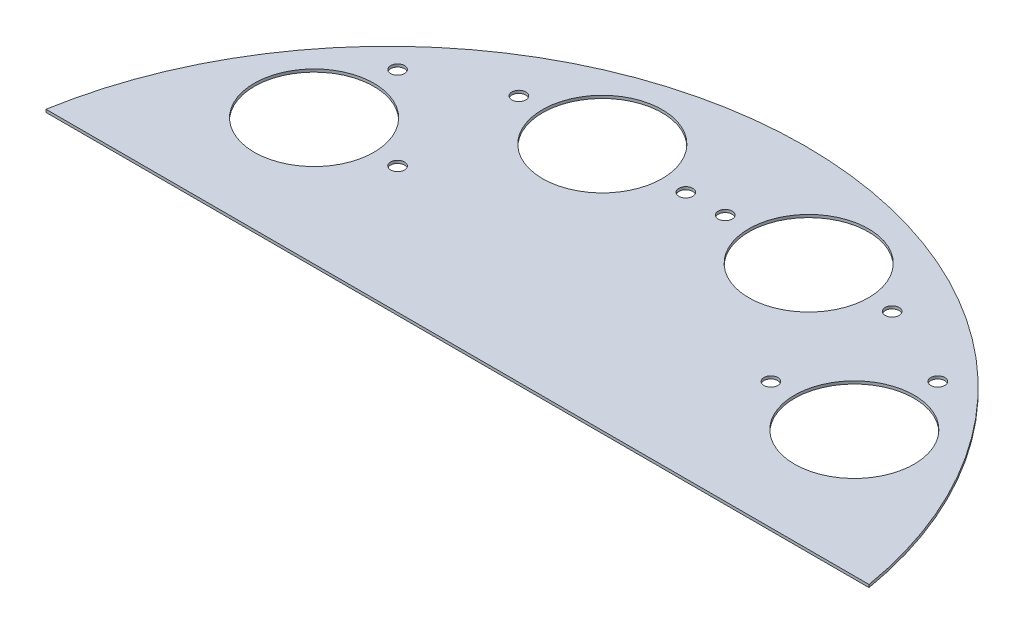
ISO-10303-21;
HEADER;
FILE_DESCRIPTION(('STEP AP214'),'2;1');
FILE_NAME('part.step','',(''),(''),'','','');
FILE_SCHEMA(('AUTOMOTIVE_DESIGN { 1 0 10303 214 1 1 1 1 }'));
ENDSEC;
DATA;
#1=APPLICATION_CONTEXT('core data for automotive mechanical design processes');
#2=APPLICATION_PROTOCOL_DEFINITION('international standard','automotive_design',2000,#1);
#3=PRODUCT_CONTEXT('',#1,'mechanical');
#4=PRODUCT('Part','Part','',(#3));
#5=PRODUCT_RELATED_PRODUCT_CATEGORY('part','',(#4));
#6=PRODUCT_DEFINITION_FORMATION('','',#4);
#7=PRODUCT_DEFINITION_CONTEXT('part definition',#1,'design');
#8=PRODUCT_DEFINITION('design','',#6,#7);
#9=PRODUCT_DEFINITION_SHAPE('','',#8);
#10=(LENGTH_UNIT() NAMED_UNIT(*) SI_UNIT(.MILLI.,.METRE.));
#11=(NAMED_UNIT(*) PLANE_ANGLE_UNIT() SI_UNIT($,.RADIAN.));
#12=(NAMED_UNIT(*) SI_UNIT($,.STERADIAN.) SOLID_ANGLE_UNIT());
#13=UNCERTAINTY_MEASURE_WITH_UNIT(LENGTH_MEASURE(1.E-05),#10,'distance_accuracy_value','');
#14=(GEOMETRIC_REPRESENTATION_CONTEXT(3) GLOBAL_UNCERTAINTY_ASSIGNED_CONTEXT((#13)) GLOBAL_UNIT_ASSIGNED_CONTEXT((#10,
#11,#12)) REPRESENTATION_CONTEXT('',''));
#15=CARTESIAN_POINT('',(0.,0.,0.));
#16=DIRECTION('',(0.,0.,1.));
#17=DIRECTION('',(1.,0.,0.));
#18=AXIS2_PLACEMENT_3D('',#15,#16,#17);
#19=CARTESIAN_POINT('',(0.,0.,0.));
#20=DIRECTION('',(0.,1.,0.));
#21=DIRECTION('',(0.,0.,1.));
#22=AXIS2_PLACEMENT_3D('',#19,#20,#21);
#23=PLANE('',#22);
#24=CARTESIAN_POINT('',(97.237534512333,0.,-56.561617597691));
#25=DIRECTION('',(0.,-1.,0.));
#26=DIRECTION('',(0.,0.,-1.));
#27=AXIS2_PLACEMENT_3D('',#24,#25,#26);
#28=CIRCLE('',#27,2.49999999999999);
#29=CARTESIAN_POINT('',(97.237534512333,0.,-59.061617597691));
#30=VERTEX_POINT('',#29);
#31=EDGE_CURVE('E166',#30,#30,#28,.T.);
#32=ORIENTED_EDGE('',*,*,#31,.F.);
#33=EDGE_LOOP('',(#32));
#34=FACE_BOUND('',#33,.T.);
#35=CARTESIAN_POINT('',(67.237534512333,0.,-26.561617597691));
#36=DIRECTION('',(0.,-1.,0.));
#37=DIRECTION('',(0.,0.,-1.));
#38=AXIS2_PLACEMENT_3D('',#35,#36,#37);
#39=CIRCLE('',#38,2.49999999999999);
#40=CARTESIAN_POINT('',(67.237534512333,0.,-29.061617597691));
#41=VERTEX_POINT('',#40);
#42=EDGE_CURVE('E160',#41,#41,#39,.T.);
#43=ORIENTED_EDGE('',*,*,#42,.F.);
#44=EDGE_LOOP('',(#43));
#45=FACE_BOUND('',#44,.T.);
#46=CARTESIAN_POINT('',(67.2375345123306,0.,-70.1541692780059));
#47=DIRECTION('',(0.,-1.,0.));
#48=DIRECTION('',(0.,0.,-1.));
#49=AXIS2_PLACEMENT_3D('',#46,#47,#48);
#50=CIRCLE('',#49,2.49999999999999);
#51=CARTESIAN_POINT('',(67.2375345123306,0.,-72.6541692780059));
#52=VERTEX_POINT('',#51);
#53=EDGE_CURVE('E154',#52,#52,#50,.T.);
#54=ORIENTED_EDGE('',*,*,#53,.F.);
#55=EDGE_LOOP('',(#54));
#56=FACE_BOUND('',#55,.T.);
#57=CARTESIAN_POINT('',(7.23753451233063,0.,-70.1541692780059));
#58=DIRECTION('',(0.,-1.,0.));
#59=DIRECTION('',(0.,0.,-1.));
#60=AXIS2_PLACEMENT_3D('',#57,#58,#59);
#61=CIRCLE('',#60,2.49999999999999);
#62=CARTESIAN_POINT('',(7.23753451233063,0.,-72.6541692780059));
#63=VERTEX_POINT('',#62);
#64=EDGE_CURVE('E148',#63,#63,#61,.T.);
#65=ORIENTED_EDGE('',*,*,#64,.F.);
#66=EDGE_LOOP('',(#65));
#67=FACE_BOUND('',#66,.T.);
#68=CARTESIAN_POINT('',(-66.926544137657,0.,-70.1541692780059));
#69=DIRECTION('',(0.,-1.,0.));
#70=DIRECTION('',(0.,0.,-1.));
#71=AXIS2_PLACEMENT_3D('',#68,#69,#70);
#72=CIRCLE('',#71,2.49999999999999);
#73=CARTESIAN_POINT('',(-66.926544137657,0.,-72.6541692780059));
#74=VERTEX_POINT('',#73);
#75=EDGE_CURVE('E136',#74,#74,#72,.T.);
#76=ORIENTED_EDGE('',*,*,#75,.F.);
#77=EDGE_LOOP('',(#76));
#78=FACE_BOUND('',#77,.T.);
#79=CARTESIAN_POINT('',(-96.9265441376548,0.,-56.5616175976809));
#80=DIRECTION('',(0.,-1.,0.));
#81=DIRECTION('',(0.,0.,-1.));
#82=AXIS2_PLACEMENT_3D('',#79,#80,#81);
#83=CIRCLE('',#82,2.49999999999999);
#84=CARTESIAN_POINT('',(-96.9265441376548,0.,-59.0616175976809));
#85=VERTEX_POINT('',#84);
#86=EDGE_CURVE('E127',#85,#85,#83,.T.);
#87=ORIENTED_EDGE('',*,*,#86,.F.);
#88=EDGE_LOOP('',(#87));
#89=FACE_BOUND('',#88,.T.);
#90=CARTESIAN_POINT('',(-66.9265441376548,0.,-26.561617597691));
#91=DIRECTION('',(0.,-1.,0.));
#92=DIRECTION('',(0.,0.,-1.));
#93=AXIS2_PLACEMENT_3D('',#90,#91,#92);
#94=CIRCLE('',#93,2.49999999999999);
#95=CARTESIAN_POINT('',(-66.9265441376548,0.,-29.061617597691));
#96=VERTEX_POINT('',#95);
#97=EDGE_CURVE('E126',#96,#96,#94,.T.);
#98=ORIENTED_EDGE('',*,*,#97,.F.);
#99=EDGE_LOOP('',(#98));
#100=FACE_BOUND('',#99,.T.);
#101=CARTESIAN_POINT('',(0.155495187338843,0.,43.9726126774052));
#102=DIRECTION('',(0.,1.,0.));
#103=DIRECTION('',(0.,0.,1.));
#104=AXIS2_PLACEMENT_3D('',#101,#102,#103);
#105=CIRCLE('',#104,150.);
#106=CARTESIAN_POINT('',(148.057489764829,0.,18.9726126774052));
#107=VERTEX_POINT('',#106);
#108=CARTESIAN_POINT('',(-147.746499390152,0.,18.9726126774052));
#109=VERTEX_POINT('',#108);
#110=EDGE_CURVE('E60',#107,#109,#105,.T.);
#111=ORIENTED_EDGE('',*,*,#110,.F.);
#112=DIRECTION('',(-1.,0.,0.));
#113=VECTOR('',#112,1.);
#114=CARTESIAN_POINT('',(0.,0.,18.9726126774052));
#115=LINE('',#114,#113);
#116=EDGE_CURVE('E67',#107,#109,#115,.T.);
#117=ORIENTED_EDGE('',*,*,#116,.T.);
#118=EDGE_LOOP('',(#111,#117));
#119=FACE_BOUND('',#118,.T.);
#120=CARTESIAN_POINT('',(-96.9265441376548,0.,-26.5616175976809));
#121=DIRECTION('',(0.,1.,0.));
#122=DIRECTION('',(0.,0.,1.));
#123=AXIS2_PLACEMENT_3D('',#120,#121,#122);
#124=CIRCLE('',#123,21.5);
#125=CARTESIAN_POINT('',(-96.9265441376548,0.,-5.0616175976809));
#126=VERTEX_POINT('',#125);
#127=EDGE_CURVE('E71',#126,#126,#124,.T.);
#128=ORIENTED_EDGE('',*,*,#127,.T.);
#129=EDGE_LOOP('',(#128));
#130=FACE_BOUND('',#129,.T.);
#131=CARTESIAN_POINT('',(-36.926544137657,0.,-70.1541692780059));
#132=DIRECTION('',(0.,1.,0.));
#133=DIRECTION('',(0.,0.,1.));
#134=AXIS2_PLACEMENT_3D('',#131,#132,#133);
#135=CIRCLE('',#134,21.5);
#136=CARTESIAN_POINT('',(-36.926544137657,0.,-48.6541692780059));
#137=VERTEX_POINT('',#136);
#138=EDGE_CURVE('E74',#137,#137,#135,.T.);
#139=ORIENTED_EDGE('',*,*,#138,.T.);
#140=EDGE_LOOP('',(#139));
#141=FACE_BOUND('',#140,.T.);
#142=CARTESIAN_POINT('',(37.2375345123306,0.,-70.1541692780098));
#143=DIRECTION('',(0.,1.,0.));
#144=DIRECTION('',(0.,0.,1.));
#145=AXIS2_PLACEMENT_3D('',#142,#143,#144);
#146=CIRCLE('',#145,21.5);
#147=CARTESIAN_POINT('',(37.2375345123306,0.,-48.6541692780098));
#148=VERTEX_POINT('',#147);
#149=EDGE_CURVE('E80',#148,#148,#146,.T.);
#150=ORIENTED_EDGE('',*,*,#149,.T.);
#151=EDGE_LOOP('',(#150));
#152=FACE_BOUND('',#151,.T.);
#153=CARTESIAN_POINT('',(97.237534512333,0.,-26.561617597691));
#154=DIRECTION('',(0.,1.,0.));
#155=DIRECTION('',(0.,0.,1.));
#156=AXIS2_PLACEMENT_3D('',#153,#154,#155);
#157=CIRCLE('',#156,21.5);
#158=CARTESIAN_POINT('',(97.237534512333,0.,-5.06161759769103));
#159=VERTEX_POINT('',#158);
#160=EDGE_CURVE('E83',#159,#159,#157,.T.);
#161=ORIENTED_EDGE('',*,*,#160,.T.);
#162=EDGE_LOOP('',(#161));
#163=FACE_BOUND('',#162,.T.);
#164=CARTESIAN_POINT('',(-6.92654413765696,0.,-70.1541692780059));
#165=DIRECTION('',(0.,-1.,0.));
#166=DIRECTION('',(0.,0.,-1.));
#167=AXIS2_PLACEMENT_3D('',#164,#165,#166);
#168=CIRCLE('',#167,2.49999999999999);
#169=CARTESIAN_POINT('',(-6.92654413765696,0.,-72.6541692780059));
#170=VERTEX_POINT('',#169);
#171=EDGE_CURVE('E142',#170,#170,#168,.T.);
#172=ORIENTED_EDGE('',*,*,#171,.F.);
#173=EDGE_LOOP('',(#172));
#174=FACE_BOUND('',#173,.T.);
#175=ADVANCED_FACE('F35',(#34,#45,#56,#67,#78,#89,#100,#119,#130,#141,#152,#163,#174),#23,.F.);
#176=CARTESIAN_POINT('',(0.,1.,0.));
#177=DIRECTION('',(0.,1.,0.));
#178=DIRECTION('',(0.,0.,1.));
#179=AXIS2_PLACEMENT_3D('',#176,#177,#178);
#180=PLANE('',#179);
#181=CARTESIAN_POINT('',(97.237534512333,1.,-56.561617597691));
#182=DIRECTION('',(0.,-1.,0.));
#183=DIRECTION('',(0.,0.,-1.));
#184=AXIS2_PLACEMENT_3D('',#181,#182,#183);
#185=CIRCLE('',#184,2.5);
#186=CARTESIAN_POINT('',(97.237534512333,1.,-59.061617597691));
#187=VERTEX_POINT('',#186);
#188=EDGE_CURVE('E163',#187,#187,#185,.T.);
#189=ORIENTED_EDGE('',*,*,#188,.T.);
#190=EDGE_LOOP('',(#189));
#191=FACE_BOUND('',#190,.T.);
#192=CARTESIAN_POINT('',(67.237534512333,1.,-26.561617597691));
#193=DIRECTION('',(0.,-1.,0.));
#194=DIRECTION('',(0.,0.,-1.));
#195=AXIS2_PLACEMENT_3D('',#192,#193,#194);
#196=CIRCLE('',#195,2.5);
#197=CARTESIAN_POINT('',(67.237534512333,1.,-29.061617597691));
#198=VERTEX_POINT('',#197);
#199=EDGE_CURVE('E157',#198,#198,#196,.T.);
#200=ORIENTED_EDGE('',*,*,#199,.T.);
#201=EDGE_LOOP('',(#200));
#202=FACE_BOUND('',#201,.T.);
#203=CARTESIAN_POINT('',(67.2375345123306,1.,-70.1541692780059));
#204=DIRECTION('',(0.,-1.,0.));
#205=DIRECTION('',(0.,0.,-1.));
#206=AXIS2_PLACEMENT_3D('',#203,#204,#205);
#207=CIRCLE('',#206,2.5);
#208=CARTESIAN_POINT('',(67.2375345123306,1.,-72.6541692780059));
#209=VERTEX_POINT('',#208);
#210=EDGE_CURVE('E151',#209,#209,#207,.T.);
#211=ORIENTED_EDGE('',*,*,#210,.T.);
#212=EDGE_LOOP('',(#211));
#213=FACE_BOUND('',#212,.T.);
#214=CARTESIAN_POINT('',(7.23753451233063,1.,-70.1541692780059));
#215=DIRECTION('',(0.,-1.,0.));
#216=DIRECTION('',(0.,0.,-1.));
#217=AXIS2_PLACEMENT_3D('',#214,#215,#216);
#218=CIRCLE('',#217,2.5);
#219=CARTESIAN_POINT('',(7.23753451233063,1.,-72.6541692780059));
#220=VERTEX_POINT('',#219);
#221=EDGE_CURVE('E145',#220,#220,#218,.T.);
#222=ORIENTED_EDGE('',*,*,#221,.T.);
#223=EDGE_LOOP('',(#222));
#224=FACE_BOUND('',#223,.T.);
#225=CARTESIAN_POINT('',(-6.92654413765696,1.,-70.1541692780059));
#226=DIRECTION('',(0.,-1.,0.));
#227=DIRECTION('',(0.,0.,-1.));
#228=AXIS2_PLACEMENT_3D('',#225,#226,#227);
#229=CIRCLE('',#228,2.5);
#230=CARTESIAN_POINT('',(-6.92654413765696,1.,-72.6541692780059));
#231=VERTEX_POINT('',#230);
#232=EDGE_CURVE('E139',#231,#231,#229,.T.);
#233=ORIENTED_EDGE('',*,*,#232,.T.);
#234=EDGE_LOOP('',(#233));
#235=FACE_BOUND('',#234,.T.);
#236=CARTESIAN_POINT('',(-66.926544137657,1.,-70.1541692780059));
#237=DIRECTION('',(0.,-1.,0.));
#238=DIRECTION('',(0.,0.,-1.));
#239=AXIS2_PLACEMENT_3D('',#236,#237,#238);
#240=CIRCLE('',#239,2.5);
#241=CARTESIAN_POINT('',(-66.926544137657,1.,-72.6541692780059));
#242=VERTEX_POINT('',#241);
#243=EDGE_CURVE('E131',#242,#242,#240,.T.);
#244=ORIENTED_EDGE('',*,*,#243,.T.);
#245=EDGE_LOOP('',(#244));
#246=FACE_BOUND('',#245,.T.);
#247=CARTESIAN_POINT('',(97.237534512333,1.,-26.561617597691));
#248=DIRECTION('',(0.,1.,0.));
#249=DIRECTION('',(0.,0.,1.));
#250=AXIS2_PLACEMENT_3D('',#247,#248,#249);
#251=CIRCLE('',#250,21.5);
#252=CARTESIAN_POINT('',(97.237534512333,1.,-5.06161759769103));
#253=VERTEX_POINT('',#252);
#254=EDGE_CURVE('E64',#253,#253,#251,.T.);
#255=ORIENTED_EDGE('',*,*,#254,.F.);
#256=EDGE_LOOP('',(#255));
#257=FACE_BOUND('',#256,.T.);
#258=CARTESIAN_POINT('',(37.2375345123306,1.,-70.1541692780098));
#259=DIRECTION('',(0.,1.,0.));
#260=DIRECTION('',(0.,0.,1.));
#261=AXIS2_PLACEMENT_3D('',#258,#259,#260);
#262=CIRCLE('',#261,21.5);
#263=CARTESIAN_POINT('',(37.2375345123306,1.,-48.6541692780098));
#264=VERTEX_POINT('',#263);
#265=EDGE_CURVE('E100',#264,#264,#262,.T.);
#266=ORIENTED_EDGE('',*,*,#265,.F.);
#267=EDGE_LOOP('',(#266));
#268=FACE_BOUND('',#267,.T.);
#269=CARTESIAN_POINT('',(-36.926544137657,1.,-70.1541692780059));
#270=DIRECTION('',(0.,1.,0.));
#271=DIRECTION('',(0.,0.,1.));
#272=AXIS2_PLACEMENT_3D('',#269,#270,#271);
#273=CIRCLE('',#272,21.5);
#274=CARTESIAN_POINT('',(-36.926544137657,1.,-48.6541692780059));
#275=VERTEX_POINT('',#274);
#276=EDGE_CURVE('E97',#275,#275,#273,.T.);
#277=ORIENTED_EDGE('',*,*,#276,.F.);
#278=EDGE_LOOP('',(#277));
#279=FACE_BOUND('',#278,.T.);
#280=CARTESIAN_POINT('',(-96.9265441376548,1.,-26.5616175976809));
#281=DIRECTION('',(0.,1.,0.));
#282=DIRECTION('',(0.,0.,1.));
#283=AXIS2_PLACEMENT_3D('',#280,#281,#282);
#284=CIRCLE('',#283,21.5);
#285=CARTESIAN_POINT('',(-96.9265441376548,1.,-5.0616175976809));
#286=VERTEX_POINT('',#285);
#287=EDGE_CURVE('E90',#286,#286,#284,.T.);
#288=ORIENTED_EDGE('',*,*,#287,.F.);
#289=EDGE_LOOP('',(#288));
#290=FACE_BOUND('',#289,.T.);
#291=CARTESIAN_POINT('',(0.155495187338843,1.,43.9726126774052));
#292=DIRECTION('',(0.,1.,0.));
#293=DIRECTION('',(0.,0.,1.));
#294=AXIS2_PLACEMENT_3D('',#291,#292,#293);
#295=CIRCLE('',#294,150.);
#296=CARTESIAN_POINT('',(148.057489764829,1.,18.9726126774052));
#297=VERTEX_POINT('',#296);
#298=CARTESIAN_POINT('',(-147.746499390152,1.,18.9726126774052));
#299=VERTEX_POINT('',#298);
#300=EDGE_CURVE('E62',#297,#299,#295,.T.);
#301=ORIENTED_EDGE('',*,*,#300,.T.);
#302=DIRECTION('',(-1.,0.,0.));
#303=VECTOR('',#302,1.);
#304=CARTESIAN_POINT('',(0.,1.,18.9726126774052));
#305=LINE('',#304,#303);
#306=EDGE_CURVE('E87',#297,#299,#305,.T.);
#307=ORIENTED_EDGE('',*,*,#306,.F.);
#308=EDGE_LOOP('',(#301,#307));
#309=FACE_BOUND('',#308,.T.);
#310=CARTESIAN_POINT('',(-66.9265441376548,1.,-26.561617597691));
#311=DIRECTION('',(0.,-1.,0.));
#312=DIRECTION('',(0.,0.,-1.));
#313=AXIS2_PLACEMENT_3D('',#310,#311,#312);
#314=CIRCLE('',#313,2.5);
#315=CARTESIAN_POINT('',(-66.9265441376548,1.,-29.061617597691));
#316=VERTEX_POINT('',#315);
#317=EDGE_CURVE('E68',#316,#316,#314,.T.);
#318=ORIENTED_EDGE('',*,*,#317,.T.);
#319=EDGE_LOOP('',(#318));
#320=FACE_BOUND('',#319,.T.);
#321=CARTESIAN_POINT('',(-96.9265441376548,1.,-56.5616175976809));
#322=DIRECTION('',(0.,-1.,0.));
#323=DIRECTION('',(0.,0.,-1.));
#324=AXIS2_PLACEMENT_3D('',#321,#322,#323);
#325=CIRCLE('',#324,2.5);
#326=CARTESIAN_POINT('',(-96.9265441376548,1.,-59.0616175976809));
#327=VERTEX_POINT('',#326);
#328=EDGE_CURVE('E124',#327,#327,#325,.T.);
#329=ORIENTED_EDGE('',*,*,#328,.T.);
#330=EDGE_LOOP('',(#329));
#331=FACE_BOUND('',#330,.T.);
#332=ADVANCED_FACE('F108',(#191,#202,#213,#224,#235,#246,#257,#268,#279,#290,#309,#320,#331),
#180,.T.);
#333=CARTESIAN_POINT('',(0.155495187338843,1.,43.9726126774052));
#334=DIRECTION('',(0.,-1.,0.));
#335=DIRECTION('',(0.,0.,-1.));
#336=AXIS2_PLACEMENT_3D('',#333,#334,#335);
#337=CYLINDRICAL_SURFACE('',#336,150.);
#338=ORIENTED_EDGE('',*,*,#110,.T.);
#339=DIRECTION('',(0.,-1.,0.));
#340=VECTOR('',#339,1.);
#341=CARTESIAN_POINT('',(-147.746499390152,1.,18.9726126774052));
#342=LINE('',#341,#340);
#343=EDGE_CURVE('E11',#299,#109,#342,.T.);
#344=ORIENTED_EDGE('',*,*,#343,.F.);
#345=ORIENTED_EDGE('',*,*,#300,.F.);
#346=DIRECTION('',(0.,-1.,0.));
#347=VECTOR('',#346,1.);
#348=CARTESIAN_POINT('',(148.057489764829,1.,18.9726126774052));
#349=LINE('',#348,#347);
#350=EDGE_CURVE('E44',#297,#107,#349,.T.);
#351=ORIENTED_EDGE('',*,*,#350,.T.);
#352=EDGE_LOOP('',(#338,#344,#345,#351));
#353=FACE_BOUND('',#352,.T.);
#354=ADVANCED_FACE('F37',(#353),#337,.T.);
#355=CARTESIAN_POINT('',(37.2375345123306,1.,-70.1541692780098));
#356=DIRECTION('',(0.,-1.,0.));
#357=DIRECTION('',(0.,0.,-1.));
#358=AXIS2_PLACEMENT_3D('',#355,#356,#357);
#359=CYLINDRICAL_SURFACE('',#358,21.5);
#360=ORIENTED_EDGE('',*,*,#265,.T.);
#361=EDGE_LOOP('',(#360));
#362=FACE_BOUND('',#361,.T.);
#363=ORIENTED_EDGE('',*,*,#149,.F.);
#364=EDGE_LOOP('',(#363));
#365=FACE_BOUND('',#364,.T.);
#366=ADVANCED_FACE('F201',(#362,#365),#359,.F.);
#367=CARTESIAN_POINT('',(-36.926544137657,1.,-70.1541692780059));
#368=DIRECTION('',(0.,-1.,0.));
#369=DIRECTION('',(0.,0.,-1.));
#370=AXIS2_PLACEMENT_3D('',#367,#368,#369);
#371=CYLINDRICAL_SURFACE('',#370,21.5);
#372=ORIENTED_EDGE('',*,*,#276,.T.);
#373=EDGE_LOOP('',(#372));
#374=FACE_BOUND('',#373,.T.);
#375=ORIENTED_EDGE('',*,*,#138,.F.);
#376=EDGE_LOOP('',(#375));
#377=FACE_BOUND('',#376,.T.);
#378=ADVANCED_FACE('F204',(#374,#377),#371,.F.);
#379=CARTESIAN_POINT('',(-96.9265441376548,1.,-26.5616175976809));
#380=DIRECTION('',(0.,-1.,0.));
#381=DIRECTION('',(0.,0.,-1.));
#382=AXIS2_PLACEMENT_3D('',#379,#380,#381);
#383=CYLINDRICAL_SURFACE('',#382,21.5);
#384=ORIENTED_EDGE('',*,*,#287,.T.);
#385=EDGE_LOOP('',(#384));
#386=FACE_BOUND('',#385,.T.);
#387=ORIENTED_EDGE('',*,*,#127,.F.);
#388=EDGE_LOOP('',(#387));
#389=FACE_BOUND('',#388,.T.);
#390=ADVANCED_FACE('F208',(#386,#389),#383,.F.);
#391=CARTESIAN_POINT('',(0.,1.,18.9726126774052));
#392=DIRECTION('',(0.,0.,1.));
#393=DIRECTION('',(1.,0.,0.));
#394=AXIS2_PLACEMENT_3D('',#391,#392,#393);
#395=PLANE('',#394);
#396=ORIENTED_EDGE('',*,*,#116,.F.);
#397=ORIENTED_EDGE('',*,*,#350,.F.);
#398=ORIENTED_EDGE('',*,*,#306,.T.);
#399=ORIENTED_EDGE('',*,*,#343,.T.);
#400=EDGE_LOOP('',(#396,#397,#398,#399));
#401=FACE_BOUND('',#400,.T.);
#402=ADVANCED_FACE('F70',(#401),#395,.T.);
#403=CARTESIAN_POINT('',(97.237534512333,1.,-26.561617597691));
#404=DIRECTION('',(0.,-1.,0.));
#405=DIRECTION('',(0.,0.,-1.));
#406=AXIS2_PLACEMENT_3D('',#403,#404,#405);
#407=CYLINDRICAL_SURFACE('',#406,21.5);
#408=ORIENTED_EDGE('',*,*,#254,.T.);
#409=EDGE_LOOP('',(#408));
#410=FACE_BOUND('',#409,.T.);
#411=ORIENTED_EDGE('',*,*,#160,.F.);
#412=EDGE_LOOP('',(#411));
#413=FACE_BOUND('',#412,.T.);
#414=ADVANCED_FACE('F105',(#410,#413),#407,.F.);
#415=CARTESIAN_POINT('',(-66.9265441376548,0.,-26.561617597691));
#416=DIRECTION('',(0.,-1.,0.));
#417=DIRECTION('',(0.,0.,-1.));
#418=AXIS2_PLACEMENT_3D('',#415,#416,#417);
#419=CYLINDRICAL_SURFACE('',#418,2.5);
#420=ORIENTED_EDGE('',*,*,#317,.F.);
#421=EDGE_LOOP('',(#420));
#422=FACE_BOUND('',#421,.T.);
#423=ORIENTED_EDGE('',*,*,#97,.T.);
#424=EDGE_LOOP('',(#423));
#425=FACE_BOUND('',#424,.T.);
#426=ADVANCED_FACE('F187',(#422,#425),#419,.F.);
#427=CARTESIAN_POINT('',(-96.9265441376548,0.,-56.5616175976809));
#428=DIRECTION('',(0.,-1.,0.));
#429=DIRECTION('',(0.,0.,-1.));
#430=AXIS2_PLACEMENT_3D('',#427,#428,#429);
#431=CYLINDRICAL_SURFACE('',#430,2.5);
#432=ORIENTED_EDGE('',*,*,#328,.F.);
#433=EDGE_LOOP('',(#432));
#434=FACE_BOUND('',#433,.T.);
#435=ORIENTED_EDGE('',*,*,#86,.T.);
#436=EDGE_LOOP('',(#435));
#437=FACE_BOUND('',#436,.T.);
#438=ADVANCED_FACE('F189',(#434,#437),#431,.F.);
#439=CARTESIAN_POINT('',(-66.926544137657,0.,-70.1541692780059));
#440=DIRECTION('',(0.,-1.,0.));
#441=DIRECTION('',(0.,0.,-1.));
#442=AXIS2_PLACEMENT_3D('',#439,#440,#441);
#443=CYLINDRICAL_SURFACE('',#442,2.5);
#444=ORIENTED_EDGE('',*,*,#243,.F.);
#445=EDGE_LOOP('',(#444));
#446=FACE_BOUND('',#445,.T.);
#447=ORIENTED_EDGE('',*,*,#75,.T.);
#448=EDGE_LOOP('',(#447));
#449=FACE_BOUND('',#448,.T.);
#450=ADVANCED_FACE('F196',(#446,#449),#443,.F.);
#451=CARTESIAN_POINT('',(-6.92654413765696,0.,-70.1541692780059));
#452=DIRECTION('',(0.,-1.,0.));
#453=DIRECTION('',(0.,0.,-1.));
#454=AXIS2_PLACEMENT_3D('',#451,#452,#453);
#455=CYLINDRICAL_SURFACE('',#454,2.49999999999999);
#456=ORIENTED_EDGE('',*,*,#232,.F.);
#457=EDGE_LOOP('',(#456));
#458=FACE_BOUND('',#457,.T.);
#459=ORIENTED_EDGE('',*,*,#171,.T.);
#460=EDGE_LOOP('',(#459));
#461=FACE_BOUND('',#460,.T.);
#462=ADVANCED_FACE('F253',(#458,#461),#455,.F.);
#463=CARTESIAN_POINT('',(7.23753451233063,0.,-70.1541692780059));
#464=DIRECTION('',(0.,-1.,0.));
#465=DIRECTION('',(0.,0.,-1.));
#466=AXIS2_PLACEMENT_3D('',#463,#464,#465);
#467=CYLINDRICAL_SURFACE('',#466,2.49999999999999);
#468=ORIENTED_EDGE('',*,*,#221,.F.);
#469=EDGE_LOOP('',(#468));
#470=FACE_BOUND('',#469,.T.);
#471=ORIENTED_EDGE('',*,*,#64,.T.);
#472=EDGE_LOOP('',(#471));
#473=FACE_BOUND('',#472,.T.);
#474=ADVANCED_FACE('F262',(#470,#473),#467,.F.);
#475=CARTESIAN_POINT('',(67.2375345123306,0.,-70.1541692780059));
#476=DIRECTION('',(0.,-1.,0.));
#477=DIRECTION('',(0.,0.,-1.));
#478=AXIS2_PLACEMENT_3D('',#475,#476,#477);
#479=CYLINDRICAL_SURFACE('',#478,2.5);
#480=ORIENTED_EDGE('',*,*,#210,.F.);
#481=EDGE_LOOP('',(#480));
#482=FACE_BOUND('',#481,.T.);
#483=ORIENTED_EDGE('',*,*,#53,.T.);
#484=EDGE_LOOP('',(#483));
#485=FACE_BOUND('',#484,.T.);
#486=ADVANCED_FACE('F272',(#482,#485),#479,.F.);
#487=CARTESIAN_POINT('',(67.237534512333,0.,-26.561617597691));
#488=DIRECTION('',(0.,-1.,0.));
#489=DIRECTION('',(0.,0.,-1.));
#490=AXIS2_PLACEMENT_3D('',#487,#488,#489);
#491=CYLINDRICAL_SURFACE('',#490,2.5);
#492=ORIENTED_EDGE('',*,*,#199,.F.);
#493=EDGE_LOOP('',(#492));
#494=FACE_BOUND('',#493,.T.);
#495=ORIENTED_EDGE('',*,*,#42,.T.);
#496=EDGE_LOOP('',(#495));
#497=FACE_BOUND('',#496,.T.);
#498=ADVANCED_FACE('F282',(#494,#497),#491,.F.);
#499=CARTESIAN_POINT('',(97.237534512333,0.,-56.561617597691));
#500=DIRECTION('',(0.,-1.,0.));
#501=DIRECTION('',(0.,0.,-1.));
#502=AXIS2_PLACEMENT_3D('',#499,#500,#501);
#503=CYLINDRICAL_SURFACE('',#502,2.5);
#504=ORIENTED_EDGE('',*,*,#188,.F.);
#505=EDGE_LOOP('',(#504));
#506=FACE_BOUND('',#505,.T.);
#507=ORIENTED_EDGE('',*,*,#31,.T.);
#508=EDGE_LOOP('',(#507));
#509=FACE_BOUND('',#508,.T.);
#510=ADVANCED_FACE('F170',(#506,#509),#503,.F.);
#511=CLOSED_SHELL('',(#175,#332,#354,#366,#378,#390,#402,#414,#426,#438,#450,#462,#474,#486,
#498,#510));
#512=MANIFOLD_SOLID_BREP('B2',#511);
#513=ADVANCED_BREP_SHAPE_REPRESENTATION('',(#18,#512),#14);
#514=SHAPE_DEFINITION_REPRESENTATION(#9,#513);
ENDSEC;
END-ISO-10303-21;
